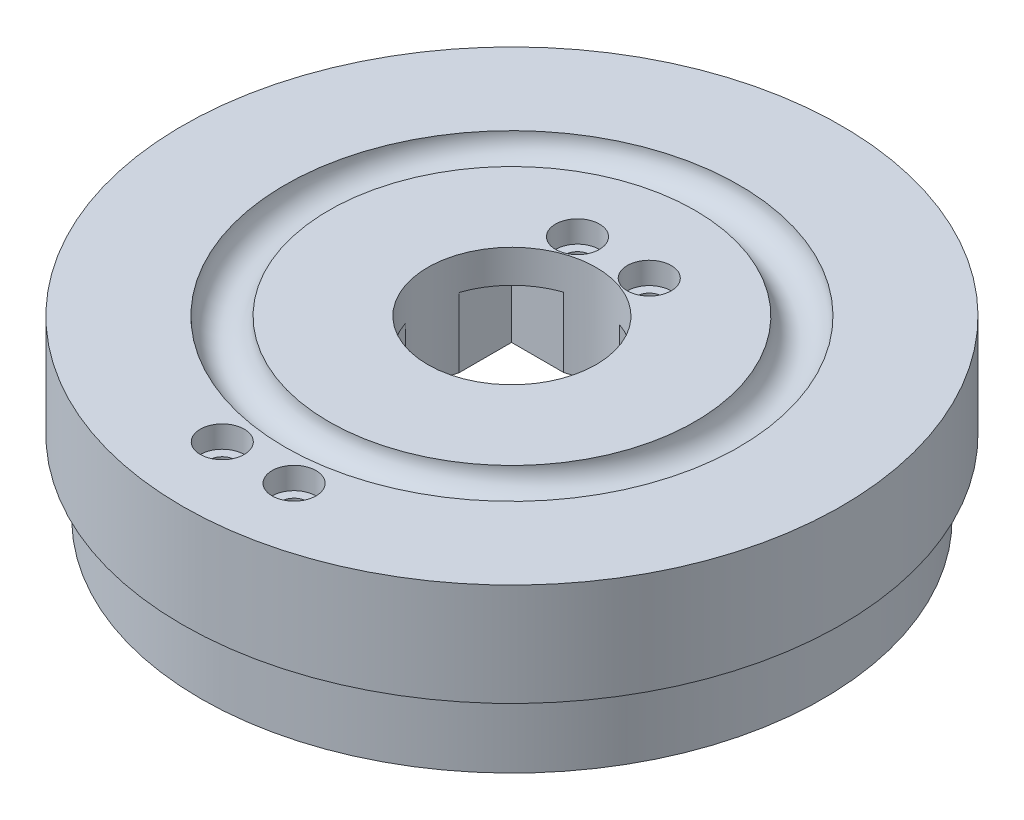
ISO-10303-21;
HEADER;
FILE_DESCRIPTION(('STEP AP214'),'2;1');
FILE_NAME('part.step','',(''),(''),'','','');
FILE_SCHEMA(('AUTOMOTIVE_DESIGN { 1 0 10303 214 1 1 1 1 }'));
ENDSEC;
DATA;
#1=APPLICATION_CONTEXT('core data for automotive mechanical design processes');
#2=APPLICATION_PROTOCOL_DEFINITION('international standard','automotive_design',2000,#1);
#3=PRODUCT_CONTEXT('',#1,'mechanical');
#4=PRODUCT('Part','Part','',(#3));
#5=PRODUCT_RELATED_PRODUCT_CATEGORY('part','',(#4));
#6=PRODUCT_DEFINITION_FORMATION('','',#4);
#7=PRODUCT_DEFINITION_CONTEXT('part definition',#1,'design');
#8=PRODUCT_DEFINITION('design','',#6,#7);
#9=PRODUCT_DEFINITION_SHAPE('','',#8);
#10=(LENGTH_UNIT() NAMED_UNIT(*) SI_UNIT(.MILLI.,.METRE.));
#11=(NAMED_UNIT(*) PLANE_ANGLE_UNIT() SI_UNIT($,.RADIAN.));
#12=(NAMED_UNIT(*) SI_UNIT($,.STERADIAN.) SOLID_ANGLE_UNIT());
#13=UNCERTAINTY_MEASURE_WITH_UNIT(LENGTH_MEASURE(1.E-05),#10,'distance_accuracy_value','');
#14=(GEOMETRIC_REPRESENTATION_CONTEXT(3) GLOBAL_UNCERTAINTY_ASSIGNED_CONTEXT((#13)) GLOBAL_UNIT_ASSIGNED_CONTEXT((#10,
#11,#12)) REPRESENTATION_CONTEXT('',''));
#15=CARTESIAN_POINT('',(0.,0.,0.));
#16=DIRECTION('',(0.,0.,1.));
#17=DIRECTION('',(1.,0.,0.));
#18=AXIS2_PLACEMENT_3D('',#15,#16,#17);
#19=CARTESIAN_POINT('',(0.,0.,0.));
#20=DIRECTION('',(0.,1.,0.));
#21=DIRECTION('',(0.,0.,1.));
#22=AXIS2_PLACEMENT_3D('',#19,#20,#21);
#23=PLANE('',#22);
#24=CARTESIAN_POINT('',(-4.89999999999999,0.,-13.85));
#25=DIRECTION('',(0.,-1.,0.));
#26=DIRECTION('',(0.,0.,-1.));
#27=AXIS2_PLACEMENT_3D('',#24,#25,#26);
#28=CIRCLE('',#27,1.75);
#29=CARTESIAN_POINT('',(-4.89999999999999,0.,-15.6));
#30=VERTEX_POINT('',#29);
#31=EDGE_CURVE('E153',#30,#30,#28,.T.);
#32=ORIENTED_EDGE('',*,*,#31,.F.);
#33=EDGE_LOOP('',(#32));
#34=FACE_BOUND('',#33,.T.);
#35=CARTESIAN_POINT('',(4.90000000000001,0.,-13.85));
#36=DIRECTION('',(0.,-1.,0.));
#37=DIRECTION('',(0.,0.,-1.));
#38=AXIS2_PLACEMENT_3D('',#35,#36,#37);
#39=CIRCLE('',#38,1.75);
#40=CARTESIAN_POINT('',(4.90000000000001,0.,-15.6));
#41=VERTEX_POINT('',#40);
#42=EDGE_CURVE('E162',#41,#41,#39,.T.);
#43=ORIENTED_EDGE('',*,*,#42,.F.);
#44=EDGE_LOOP('',(#43));
#45=FACE_BOUND('',#44,.T.);
#46=CARTESIAN_POINT('',(-4.89999999999999,0.,34.65));
#47=DIRECTION('',(0.,-1.,0.));
#48=DIRECTION('',(0.,0.,-1.));
#49=AXIS2_PLACEMENT_3D('',#46,#47,#48);
#50=CIRCLE('',#49,1.75);
#51=CARTESIAN_POINT('',(-4.89999999999999,0.,32.9));
#52=VERTEX_POINT('',#51);
#53=EDGE_CURVE('E166',#52,#52,#50,.T.);
#54=ORIENTED_EDGE('',*,*,#53,.F.);
#55=EDGE_LOOP('',(#54));
#56=FACE_BOUND('',#55,.T.);
#57=CARTESIAN_POINT('',(4.90000000000001,0.,34.65));
#58=DIRECTION('',(0.,-1.,0.));
#59=DIRECTION('',(0.,0.,-1.));
#60=AXIS2_PLACEMENT_3D('',#57,#58,#59);
#61=CIRCLE('',#60,1.75);
#62=CARTESIAN_POINT('',(4.90000000000001,0.,32.9));
#63=VERTEX_POINT('',#62);
#64=EDGE_CURVE('E170',#63,#63,#61,.T.);
#65=ORIENTED_EDGE('',*,*,#64,.F.);
#66=EDGE_LOOP('',(#65));
#67=FACE_BOUND('',#66,.T.);
#68=CARTESIAN_POINT('',(0.,0.,0.));
#69=DIRECTION('',(0.,1.,0.));
#70=DIRECTION('',(0.,0.,1.));
#71=AXIS2_PLACEMENT_3D('',#68,#69,#70);
#72=CIRCLE('',#71,11.5);
#73=CARTESIAN_POINT('',(-10.9,0.,-3.6660605559647));
#74=VERTEX_POINT('',#73);
#75=CARTESIAN_POINT('',(-10.9,0.,3.6660605559647));
#76=VERTEX_POINT('',#75);
#77=EDGE_CURVE('E207',#74,#76,#72,.T.);
#78=ORIENTED_EDGE('',*,*,#77,.T.);
#79=DIRECTION('',(0.,0.,-1.));
#80=VECTOR('',#79,1.);
#81=CARTESIAN_POINT('',(-10.9,0.,-10.85));
#82=LINE('',#81,#80);
#83=CARTESIAN_POINT('',(-10.9,0.,31.65));
#84=VERTEX_POINT('',#83);
#85=EDGE_CURVE('E141',#84,#76,#82,.T.);
#86=ORIENTED_EDGE('',*,*,#85,.F.);
#87=DIRECTION('',(-1.,0.,0.));
#88=VECTOR('',#87,1.);
#89=CARTESIAN_POINT('',(-10.9,0.,31.65));
#90=LINE('',#89,#88);
#91=CARTESIAN_POINT('',(10.9,0.,31.65));
#92=VERTEX_POINT('',#91);
#93=EDGE_CURVE('E118',#92,#84,#90,.T.);
#94=ORIENTED_EDGE('',*,*,#93,.F.);
#95=DIRECTION('',(0.,0.,1.));
#96=VECTOR('',#95,1.);
#97=CARTESIAN_POINT('',(10.9,0.,-10.85));
#98=LINE('',#97,#96);
#99=CARTESIAN_POINT('',(10.9,0.,3.66606055596465));
#100=VERTEX_POINT('',#99);
#101=EDGE_CURVE('E146',#100,#92,#98,.T.);
#102=ORIENTED_EDGE('',*,*,#101,.F.);
#103=CARTESIAN_POINT('',(10.9,0.,-3.66606055596465));
#104=VERTEX_POINT('',#103);
#105=EDGE_CURVE('E203',#100,#104,#72,.T.);
#106=ORIENTED_EDGE('',*,*,#105,.T.);
#107=CARTESIAN_POINT('',(10.9,0.,-10.85));
#108=VERTEX_POINT('',#107);
#109=EDGE_CURVE('E147',#108,#104,#98,.T.);
#110=ORIENTED_EDGE('',*,*,#109,.F.);
#111=DIRECTION('',(1.,0.,0.));
#112=VECTOR('',#111,1.);
#113=CARTESIAN_POINT('',(-10.9,0.,-10.85));
#114=LINE('',#113,#112);
#115=CARTESIAN_POINT('',(3.81149576937974,0.,-10.85));
#116=VERTEX_POINT('',#115);
#117=EDGE_CURVE('E143',#116,#108,#114,.T.);
#118=ORIENTED_EDGE('',*,*,#117,.F.);
#119=CARTESIAN_POINT('',(-3.81149576937974,0.,-10.85));
#120=VERTEX_POINT('',#119);
#121=EDGE_CURVE('E206',#116,#120,#72,.T.);
#122=ORIENTED_EDGE('',*,*,#121,.T.);
#123=CARTESIAN_POINT('',(-10.9,0.,-10.85));
#124=VERTEX_POINT('',#123);
#125=EDGE_CURVE('E144',#124,#120,#114,.T.);
#126=ORIENTED_EDGE('',*,*,#125,.F.);
#127=EDGE_CURVE('E124',#74,#124,#82,.T.);
#128=ORIENTED_EDGE('',*,*,#127,.F.);
#129=EDGE_LOOP('',(#78,#86,#94,#102,#106,#110,#118,#122,#126,#128));
#130=FACE_BOUND('',#129,.T.);
#131=CARTESIAN_POINT('',(0.,0.,0.));
#132=DIRECTION('',(0.,-1.,0.));
#133=DIRECTION('',(0.,0.,-1.));
#134=AXIS2_PLACEMENT_3D('',#131,#132,#133);
#135=CIRCLE('',#134,40.5);
#136=CARTESIAN_POINT('',(0.,0.,-40.5));
#137=VERTEX_POINT('',#136);
#138=EDGE_CURVE('E283',#137,#137,#135,.T.);
#139=ORIENTED_EDGE('',*,*,#138,.T.);
#140=EDGE_LOOP('',(#139));
#141=FACE_BOUND('',#140,.T.);
#142=ADVANCED_FACE('F35',(#34,#45,#56,#67,#130,#141),#23,.F.);
#143=CARTESIAN_POINT('',(0.,14.,0.));
#144=DIRECTION('',(0.,1.,0.));
#145=DIRECTION('',(0.,0.,1.));
#146=AXIS2_PLACEMENT_3D('',#143,#144,#145);
#147=PLANE('',#146);
#148=CARTESIAN_POINT('',(4.9,14.,34.65));
#149=DIRECTION('',(0.,1.,0.));
#150=DIRECTION('',(0.,0.,1.));
#151=AXIS2_PLACEMENT_3D('',#148,#149,#150);
#152=CIRCLE('',#151,3.);
#153=CARTESIAN_POINT('',(4.9,14.,37.65));
#154=VERTEX_POINT('',#153);
#155=EDGE_CURVE('E184',#154,#154,#152,.T.);
#156=ORIENTED_EDGE('',*,*,#155,.F.);
#157=EDGE_LOOP('',(#156));
#158=FACE_BOUND('',#157,.T.);
#159=CARTESIAN_POINT('',(-4.9,14.,34.65));
#160=DIRECTION('',(0.,1.,0.));
#161=DIRECTION('',(0.,0.,1.));
#162=AXIS2_PLACEMENT_3D('',#159,#160,#161);
#163=CIRCLE('',#162,3.);
#164=CARTESIAN_POINT('',(-4.9,14.,37.65));
#165=VERTEX_POINT('',#164);
#166=EDGE_CURVE('E190',#165,#165,#163,.T.);
#167=ORIENTED_EDGE('',*,*,#166,.F.);
#168=EDGE_LOOP('',(#167));
#169=FACE_BOUND('',#168,.T.);
#170=CARTESIAN_POINT('',(0.,14.,0.));
#171=DIRECTION('',(0.,1.,0.));
#172=DIRECTION('',(0.,0.,1.));
#173=AXIS2_PLACEMENT_3D('',#170,#171,#172);
#174=CIRCLE('',#173,45.);
#175=CARTESIAN_POINT('',(0.,14.,45.));
#176=VERTEX_POINT('',#175);
#177=EDGE_CURVE('E208',#176,#176,#174,.T.);
#178=ORIENTED_EDGE('',*,*,#177,.T.);
#179=EDGE_LOOP('',(#178));
#180=FACE_BOUND('',#179,.T.);
#181=CARTESIAN_POINT('',(0.,14.,0.));
#182=DIRECTION('',(0.,1.,0.));
#183=DIRECTION('',(0.,0.,1.));
#184=AXIS2_PLACEMENT_3D('',#181,#182,#183);
#185=CIRCLE('',#184,31.);
#186=CARTESIAN_POINT('',(0.,14.,31.));
#187=VERTEX_POINT('',#186);
#188=EDGE_CURVE('E216',#187,#187,#185,.T.);
#189=ORIENTED_EDGE('',*,*,#188,.F.);
#190=EDGE_LOOP('',(#189));
#191=FACE_BOUND('',#190,.T.);
#192=ADVANCED_FACE('F303',(#158,#169,#180,#191),#147,.T.);
#193=CARTESIAN_POINT('',(4.9,14.,-13.85));
#194=DIRECTION('',(0.,1.,0.));
#195=DIRECTION('',(0.,0.,1.));
#196=AXIS2_PLACEMENT_3D('',#193,#194,#195);
#197=CIRCLE('',#196,3.);
#198=CARTESIAN_POINT('',(4.9,14.,-10.85));
#199=VERTEX_POINT('',#198);
#200=EDGE_CURVE('E178',#199,#199,#197,.T.);
#201=ORIENTED_EDGE('',*,*,#200,.F.);
#202=EDGE_LOOP('',(#201));
#203=FACE_BOUND('',#202,.T.);
#204=CARTESIAN_POINT('',(-4.9,14.,-13.85));
#205=DIRECTION('',(0.,1.,0.));
#206=DIRECTION('',(0.,0.,1.));
#207=AXIS2_PLACEMENT_3D('',#204,#205,#206);
#208=CIRCLE('',#207,3.);
#209=CARTESIAN_POINT('',(-4.9,14.,-10.85));
#210=VERTEX_POINT('',#209);
#211=EDGE_CURVE('E177',#210,#210,#208,.T.);
#212=ORIENTED_EDGE('',*,*,#211,.F.);
#213=EDGE_LOOP('',(#212));
#214=FACE_BOUND('',#213,.T.);
#215=CARTESIAN_POINT('',(0.,14.,0.));
#216=DIRECTION('',(0.,1.,0.));
#217=DIRECTION('',(0.,0.,1.));
#218=AXIS2_PLACEMENT_3D('',#215,#216,#217);
#219=CIRCLE('',#218,11.5);
#220=CARTESIAN_POINT('',(0.,14.,11.5));
#221=VERTEX_POINT('',#220);
#222=EDGE_CURVE('E199',#221,#221,#219,.T.);
#223=ORIENTED_EDGE('',*,*,#222,.F.);
#224=EDGE_LOOP('',(#223));
#225=FACE_BOUND('',#224,.T.);
#226=CARTESIAN_POINT('',(0.,14.,0.));
#227=DIRECTION('',(0.,-1.,0.));
#228=DIRECTION('',(0.,0.,-1.));
#229=AXIS2_PLACEMENT_3D('',#226,#227,#228);
#230=CIRCLE('',#229,25.);
#231=CARTESIAN_POINT('',(0.,14.,-25.));
#232=VERTEX_POINT('',#231);
#233=EDGE_CURVE('E196',#232,#232,#230,.T.);
#234=ORIENTED_EDGE('',*,*,#233,.F.);
#235=EDGE_LOOP('',(#234));
#236=FACE_BOUND('',#235,.T.);
#237=ADVANCED_FACE('F309',(#203,#214,#225,#236),#147,.T.);
#238=CARTESIAN_POINT('',(0.,0.,0.));
#239=DIRECTION('',(0.,1.,0.));
#240=DIRECTION('',(0.,0.,1.));
#241=AXIS2_PLACEMENT_3D('',#238,#239,#240);
#242=CIRCLE('',#241,42.5);
#243=CARTESIAN_POINT('',(0.,0.,42.5));
#244=VERTEX_POINT('',#243);
#245=EDGE_CURVE('E11',#244,#244,#242,.F.);
#246=ORIENTED_EDGE('',*,*,#245,.F.);
#247=EDGE_LOOP('',(#246));
#248=FACE_BOUND('',#247,.T.);
#249=CARTESIAN_POINT('',(0.,0.,0.));
#250=DIRECTION('',(0.,1.,0.));
#251=DIRECTION('',(0.,0.,1.));
#252=AXIS2_PLACEMENT_3D('',#249,#250,#251);
#253=CIRCLE('',#252,45.);
#254=CARTESIAN_POINT('',(0.,0.,45.));
#255=VERTEX_POINT('',#254);
#256=EDGE_CURVE('E202',#255,#255,#253,.T.);
#257=ORIENTED_EDGE('',*,*,#256,.F.);
#258=EDGE_LOOP('',(#257));
#259=FACE_BOUND('',#258,.T.);
#260=ADVANCED_FACE('F305',(#248,#259),#23,.F.);
#261=CARTESIAN_POINT('',(0.,14.,0.));
#262=DIRECTION('',(0.,-1.,0.));
#263=DIRECTION('',(0.,0.,-1.));
#264=AXIS2_PLACEMENT_3D('',#261,#262,#263);
#265=CYLINDRICAL_SURFACE('',#264,45.);
#266=ORIENTED_EDGE('',*,*,#177,.F.);
#267=EDGE_LOOP('',(#266));
#268=FACE_BOUND('',#267,.T.);
#269=ORIENTED_EDGE('',*,*,#256,.T.);
#270=EDGE_LOOP('',(#269));
#271=FACE_BOUND('',#270,.T.);
#272=ADVANCED_FACE('F37',(#268,#271),#265,.T.);
#273=CARTESIAN_POINT('',(0.,14.,0.));
#274=DIRECTION('',(0.,-1.,0.));
#275=DIRECTION('',(0.,0.,-1.));
#276=AXIS2_PLACEMENT_3D('',#273,#274,#275);
#277=CYLINDRICAL_SURFACE('',#276,11.5);
#278=DIRECTION('',(0.,-1.,0.));
#279=VECTOR('',#278,1.);
#280=CARTESIAN_POINT('',(10.9,14.,-3.66606055596465));
#281=LINE('',#280,#279);
#282=CARTESIAN_POINT('',(10.9,9.5,-3.66606055596465));
#283=VERTEX_POINT('',#282);
#284=EDGE_CURVE('E43',#104,#283,#281,.F.);
#285=ORIENTED_EDGE('',*,*,#284,.F.);
#286=ORIENTED_EDGE('',*,*,#105,.F.);
#287=DIRECTION('',(0.,-1.,0.));
#288=VECTOR('',#287,1.);
#289=CARTESIAN_POINT('',(10.9,14.,3.66606055596465));
#290=LINE('',#289,#288);
#291=CARTESIAN_POINT('',(10.9,9.5,3.66606055596465));
#292=VERTEX_POINT('',#291);
#293=EDGE_CURVE('E228',#292,#100,#290,.T.);
#294=ORIENTED_EDGE('',*,*,#293,.F.);
#295=CARTESIAN_POINT('',(0.,9.5,0.));
#296=DIRECTION('',(0.,1.,0.));
#297=DIRECTION('',(0.,0.,1.));
#298=AXIS2_PLACEMENT_3D('',#295,#296,#297);
#299=CIRCLE('',#298,11.5);
#300=CARTESIAN_POINT('',(-10.9,9.5,3.6660605559647));
#301=VERTEX_POINT('',#300);
#302=EDGE_CURVE('E211',#301,#292,#299,.T.);
#303=ORIENTED_EDGE('',*,*,#302,.F.);
#304=DIRECTION('',(0.,-1.,0.));
#305=VECTOR('',#304,1.);
#306=CARTESIAN_POINT('',(-10.9,14.,3.6660605559647));
#307=LINE('',#306,#305);
#308=EDGE_CURVE('E231',#76,#301,#307,.F.);
#309=ORIENTED_EDGE('',*,*,#308,.F.);
#310=ORIENTED_EDGE('',*,*,#77,.F.);
#311=DIRECTION('',(0.,-1.,0.));
#312=VECTOR('',#311,1.);
#313=CARTESIAN_POINT('',(-10.9,14.,-3.6660605559647));
#314=LINE('',#313,#312);
#315=CARTESIAN_POINT('',(-10.9,9.5,-3.6660605559647));
#316=VERTEX_POINT('',#315);
#317=EDGE_CURVE('E235',#316,#74,#314,.T.);
#318=ORIENTED_EDGE('',*,*,#317,.F.);
#319=CARTESIAN_POINT('',(-3.81149576937974,9.5,-10.85));
#320=VERTEX_POINT('',#319);
#321=EDGE_CURVE('E114',#320,#316,#299,.T.);
#322=ORIENTED_EDGE('',*,*,#321,.F.);
#323=DIRECTION('',(0.,-1.,0.));
#324=VECTOR('',#323,1.);
#325=CARTESIAN_POINT('',(-3.81149576937974,14.,-10.85));
#326=LINE('',#325,#324);
#327=EDGE_CURVE('E132',#120,#320,#326,.F.);
#328=ORIENTED_EDGE('',*,*,#327,.F.);
#329=ORIENTED_EDGE('',*,*,#121,.F.);
#330=DIRECTION('',(0.,-1.,0.));
#331=VECTOR('',#330,1.);
#332=CARTESIAN_POINT('',(3.81149576937974,14.,-10.85));
#333=LINE('',#332,#331);
#334=CARTESIAN_POINT('',(3.81149576937974,9.5,-10.85));
#335=VERTEX_POINT('',#334);
#336=EDGE_CURVE('E237',#335,#116,#333,.T.);
#337=ORIENTED_EDGE('',*,*,#336,.F.);
#338=EDGE_CURVE('E229',#283,#335,#299,.T.);
#339=ORIENTED_EDGE('',*,*,#338,.F.);
#340=EDGE_LOOP('',(#285,#286,#294,#303,#309,#310,#318,#322,#328,#329,#337,#339));
#341=FACE_BOUND('',#340,.T.);
#342=ORIENTED_EDGE('',*,*,#222,.T.);
#343=EDGE_LOOP('',(#342));
#344=FACE_BOUND('',#343,.T.);
#345=ADVANCED_FACE('F246',(#341,#344),#277,.F.);
#346=CARTESIAN_POINT('',(0.,14.,0.));
#347=DIRECTION('',(0.,1.,0.));
#348=DIRECTION('',(0.,0.,1.));
#349=AXIS2_PLACEMENT_3D('',#346,#347,#348);
#350=TOROIDAL_SURFACE('',#349,28.,3.);
#351=ORIENTED_EDGE('',*,*,#188,.T.);
#352=EDGE_LOOP('',(#351));
#353=FACE_BOUND('',#352,.T.);
#354=ORIENTED_EDGE('',*,*,#233,.T.);
#355=EDGE_LOOP('',(#354));
#356=FACE_BOUND('',#355,.T.);
#357=ADVANCED_FACE('F334',(#353,#356),#350,.F.);
#358=CARTESIAN_POINT('',(-4.9,11.,34.65));
#359=DIRECTION('',(0.,1.,0.));
#360=DIRECTION('',(0.,0.,1.));
#361=AXIS2_PLACEMENT_3D('',#358,#359,#360);
#362=CYLINDRICAL_SURFACE('',#361,3.);
#363=CARTESIAN_POINT('',(-4.9,11.,34.65));
#364=DIRECTION('',(0.,1.,0.));
#365=DIRECTION('',(0.,0.,1.));
#366=AXIS2_PLACEMENT_3D('',#363,#364,#365);
#367=CIRCLE('',#366,3.);
#368=CARTESIAN_POINT('',(-4.9,11.,37.65));
#369=VERTEX_POINT('',#368);
#370=EDGE_CURVE('E193',#369,#369,#367,.T.);
#371=ORIENTED_EDGE('',*,*,#370,.F.);
#372=EDGE_LOOP('',(#371));
#373=FACE_BOUND('',#372,.T.);
#374=ORIENTED_EDGE('',*,*,#166,.T.);
#375=EDGE_LOOP('',(#374));
#376=FACE_BOUND('',#375,.T.);
#377=ADVANCED_FACE('F337',(#373,#376),#362,.F.);
#378=CARTESIAN_POINT('',(-4.9,11.,34.65));
#379=DIRECTION('',(0.,1.,0.));
#380=DIRECTION('',(0.,0.,1.));
#381=AXIS2_PLACEMENT_3D('',#378,#379,#380);
#382=PLANE('',#381);
#383=CARTESIAN_POINT('',(-4.89999999999999,11.,34.65));
#384=DIRECTION('',(0.,1.,0.));
#385=DIRECTION('',(0.,0.,1.));
#386=AXIS2_PLACEMENT_3D('',#383,#384,#385);
#387=CIRCLE('',#386,1.75);
#388=CARTESIAN_POINT('',(-4.89999999999999,11.,36.4));
#389=VERTEX_POINT('',#388);
#390=EDGE_CURVE('E169',#389,#389,#387,.T.);
#391=ORIENTED_EDGE('',*,*,#390,.F.);
#392=EDGE_LOOP('',(#391));
#393=FACE_BOUND('',#392,.T.);
#394=ORIENTED_EDGE('',*,*,#370,.T.);
#395=EDGE_LOOP('',(#394));
#396=FACE_BOUND('',#395,.T.);
#397=ADVANCED_FACE('F341',(#393,#396),#382,.T.);
#398=CARTESIAN_POINT('',(4.9,11.,34.65));
#399=DIRECTION('',(0.,1.,0.));
#400=DIRECTION('',(0.,0.,1.));
#401=AXIS2_PLACEMENT_3D('',#398,#399,#400);
#402=CYLINDRICAL_SURFACE('',#401,3.);
#403=CARTESIAN_POINT('',(4.9,11.,34.65));
#404=DIRECTION('',(0.,1.,0.));
#405=DIRECTION('',(0.,0.,1.));
#406=AXIS2_PLACEMENT_3D('',#403,#404,#405);
#407=CIRCLE('',#406,3.);
#408=CARTESIAN_POINT('',(4.9,11.,37.65));
#409=VERTEX_POINT('',#408);
#410=EDGE_CURVE('E187',#409,#409,#407,.T.);
#411=ORIENTED_EDGE('',*,*,#410,.F.);
#412=EDGE_LOOP('',(#411));
#413=FACE_BOUND('',#412,.T.);
#414=ORIENTED_EDGE('',*,*,#155,.T.);
#415=EDGE_LOOP('',(#414));
#416=FACE_BOUND('',#415,.T.);
#417=ADVANCED_FACE('F345',(#413,#416),#402,.F.);
#418=CARTESIAN_POINT('',(4.9,11.,34.65));
#419=DIRECTION('',(0.,1.,0.));
#420=DIRECTION('',(0.,0.,1.));
#421=AXIS2_PLACEMENT_3D('',#418,#419,#420);
#422=PLANE('',#421);
#423=CARTESIAN_POINT('',(4.90000000000001,11.,34.65));
#424=DIRECTION('',(0.,1.,0.));
#425=DIRECTION('',(0.,0.,1.));
#426=AXIS2_PLACEMENT_3D('',#423,#424,#425);
#427=CIRCLE('',#426,1.75);
#428=CARTESIAN_POINT('',(4.90000000000001,11.,36.4));
#429=VERTEX_POINT('',#428);
#430=EDGE_CURVE('E173',#429,#429,#427,.T.);
#431=ORIENTED_EDGE('',*,*,#430,.F.);
#432=EDGE_LOOP('',(#431));
#433=FACE_BOUND('',#432,.T.);
#434=ORIENTED_EDGE('',*,*,#410,.T.);
#435=EDGE_LOOP('',(#434));
#436=FACE_BOUND('',#435,.T.);
#437=ADVANCED_FACE('F349',(#433,#436),#422,.T.);
#438=CARTESIAN_POINT('',(-4.9,11.,-13.85));
#439=DIRECTION('',(0.,1.,0.));
#440=DIRECTION('',(0.,0.,1.));
#441=AXIS2_PLACEMENT_3D('',#438,#439,#440);
#442=CYLINDRICAL_SURFACE('',#441,3.);
#443=CARTESIAN_POINT('',(-4.9,11.,-13.85));
#444=DIRECTION('',(0.,1.,0.));
#445=DIRECTION('',(0.,0.,1.));
#446=AXIS2_PLACEMENT_3D('',#443,#444,#445);
#447=CIRCLE('',#446,3.);
#448=CARTESIAN_POINT('',(-4.9,11.,-10.85));
#449=VERTEX_POINT('',#448);
#450=EDGE_CURVE('E181',#449,#449,#447,.T.);
#451=ORIENTED_EDGE('',*,*,#450,.F.);
#452=EDGE_LOOP('',(#451));
#453=FACE_BOUND('',#452,.T.);
#454=ORIENTED_EDGE('',*,*,#211,.T.);
#455=EDGE_LOOP('',(#454));
#456=FACE_BOUND('',#455,.T.);
#457=ADVANCED_FACE('F353',(#453,#456),#442,.F.);
#458=CARTESIAN_POINT('',(-4.9,11.,-13.85));
#459=DIRECTION('',(0.,1.,0.));
#460=DIRECTION('',(0.,0.,1.));
#461=AXIS2_PLACEMENT_3D('',#458,#459,#460);
#462=PLANE('',#461);
#463=CARTESIAN_POINT('',(-4.89999999999999,11.,-13.85));
#464=DIRECTION('',(0.,1.,0.));
#465=DIRECTION('',(0.,0.,1.));
#466=AXIS2_PLACEMENT_3D('',#463,#464,#465);
#467=CIRCLE('',#466,1.75);
#468=CARTESIAN_POINT('',(-4.89999999999999,11.,-12.1));
#469=VERTEX_POINT('',#468);
#470=EDGE_CURVE('E161',#469,#469,#467,.T.);
#471=ORIENTED_EDGE('',*,*,#470,.F.);
#472=EDGE_LOOP('',(#471));
#473=FACE_BOUND('',#472,.T.);
#474=ORIENTED_EDGE('',*,*,#450,.T.);
#475=EDGE_LOOP('',(#474));
#476=FACE_BOUND('',#475,.T.);
#477=ADVANCED_FACE('F357',(#473,#476),#462,.T.);
#478=CARTESIAN_POINT('',(4.9,11.,-13.85));
#479=DIRECTION('',(0.,1.,0.));
#480=DIRECTION('',(0.,0.,1.));
#481=AXIS2_PLACEMENT_3D('',#478,#479,#480);
#482=CYLINDRICAL_SURFACE('',#481,3.);
#483=CARTESIAN_POINT('',(4.9,11.,-13.85));
#484=DIRECTION('',(0.,1.,0.));
#485=DIRECTION('',(0.,0.,1.));
#486=AXIS2_PLACEMENT_3D('',#483,#484,#485);
#487=CIRCLE('',#486,3.);
#488=CARTESIAN_POINT('',(4.9,11.,-10.85));
#489=VERTEX_POINT('',#488);
#490=EDGE_CURVE('E174',#489,#489,#487,.T.);
#491=ORIENTED_EDGE('',*,*,#490,.F.);
#492=EDGE_LOOP('',(#491));
#493=FACE_BOUND('',#492,.T.);
#494=ORIENTED_EDGE('',*,*,#200,.T.);
#495=EDGE_LOOP('',(#494));
#496=FACE_BOUND('',#495,.T.);
#497=ADVANCED_FACE('F361',(#493,#496),#482,.F.);
#498=CARTESIAN_POINT('',(4.9,11.,-13.85));
#499=DIRECTION('',(0.,1.,0.));
#500=DIRECTION('',(0.,0.,1.));
#501=AXIS2_PLACEMENT_3D('',#498,#499,#500);
#502=PLANE('',#501);
#503=CARTESIAN_POINT('',(4.90000000000001,11.,-13.85));
#504=DIRECTION('',(0.,1.,0.));
#505=DIRECTION('',(0.,0.,1.));
#506=AXIS2_PLACEMENT_3D('',#503,#504,#505);
#507=CIRCLE('',#506,1.75);
#508=CARTESIAN_POINT('',(4.90000000000001,11.,-12.1));
#509=VERTEX_POINT('',#508);
#510=EDGE_CURVE('E165',#509,#509,#507,.T.);
#511=ORIENTED_EDGE('',*,*,#510,.F.);
#512=EDGE_LOOP('',(#511));
#513=FACE_BOUND('',#512,.T.);
#514=ORIENTED_EDGE('',*,*,#490,.T.);
#515=EDGE_LOOP('',(#514));
#516=FACE_BOUND('',#515,.T.);
#517=ADVANCED_FACE('F365',(#513,#516),#502,.T.);
#518=CARTESIAN_POINT('',(4.90000000000001,13.,34.65));
#519=DIRECTION('',(0.,-1.,0.));
#520=DIRECTION('',(0.,0.,-1.));
#521=AXIS2_PLACEMENT_3D('',#518,#519,#520);
#522=CYLINDRICAL_SURFACE('',#521,1.75);
#523=ORIENTED_EDGE('',*,*,#430,.T.);
#524=EDGE_LOOP('',(#523));
#525=FACE_BOUND('',#524,.T.);
#526=ORIENTED_EDGE('',*,*,#64,.T.);
#527=EDGE_LOOP('',(#526));
#528=FACE_BOUND('',#527,.T.);
#529=ADVANCED_FACE('F369',(#525,#528),#522,.F.);
#530=CARTESIAN_POINT('',(-4.89999999999999,13.,34.65));
#531=DIRECTION('',(0.,-1.,0.));
#532=DIRECTION('',(0.,0.,-1.));
#533=AXIS2_PLACEMENT_3D('',#530,#531,#532);
#534=CYLINDRICAL_SURFACE('',#533,1.75);
#535=ORIENTED_EDGE('',*,*,#390,.T.);
#536=EDGE_LOOP('',(#535));
#537=FACE_BOUND('',#536,.T.);
#538=ORIENTED_EDGE('',*,*,#53,.T.);
#539=EDGE_LOOP('',(#538));
#540=FACE_BOUND('',#539,.T.);
#541=ADVANCED_FACE('F373',(#537,#540),#534,.F.);
#542=CARTESIAN_POINT('',(4.90000000000001,13.,-13.85));
#543=DIRECTION('',(0.,-1.,0.));
#544=DIRECTION('',(0.,0.,-1.));
#545=AXIS2_PLACEMENT_3D('',#542,#543,#544);
#546=CYLINDRICAL_SURFACE('',#545,1.75);
#547=ORIENTED_EDGE('',*,*,#510,.T.);
#548=EDGE_LOOP('',(#547));
#549=FACE_BOUND('',#548,.T.);
#550=ORIENTED_EDGE('',*,*,#42,.T.);
#551=EDGE_LOOP('',(#550));
#552=FACE_BOUND('',#551,.T.);
#553=ADVANCED_FACE('F377',(#549,#552),#546,.F.);
#554=CARTESIAN_POINT('',(-4.89999999999999,13.,-13.85));
#555=DIRECTION('',(0.,-1.,0.));
#556=DIRECTION('',(0.,0.,-1.));
#557=AXIS2_PLACEMENT_3D('',#554,#555,#556);
#558=CYLINDRICAL_SURFACE('',#557,1.75);
#559=ORIENTED_EDGE('',*,*,#470,.T.);
#560=EDGE_LOOP('',(#559));
#561=FACE_BOUND('',#560,.T.);
#562=ORIENTED_EDGE('',*,*,#31,.T.);
#563=EDGE_LOOP('',(#562));
#564=FACE_BOUND('',#563,.T.);
#565=ADVANCED_FACE('F381',(#561,#564),#558,.F.);
#566=CARTESIAN_POINT('',(0.,9.5,0.));
#567=DIRECTION('',(0.,1.,0.));
#568=DIRECTION('',(0.,0.,1.));
#569=AXIS2_PLACEMENT_3D('',#566,#567,#568);
#570=PLANE('',#569);
#571=ORIENTED_EDGE('',*,*,#302,.T.);
#572=DIRECTION('',(0.,0.,1.));
#573=VECTOR('',#572,1.);
#574=CARTESIAN_POINT('',(10.9,9.5,-10.85));
#575=LINE('',#574,#573);
#576=CARTESIAN_POINT('',(10.9,9.5,31.65));
#577=VERTEX_POINT('',#576);
#578=EDGE_CURVE('E133',#292,#577,#575,.T.);
#579=ORIENTED_EDGE('',*,*,#578,.T.);
#580=DIRECTION('',(-1.,0.,0.));
#581=VECTOR('',#580,1.);
#582=CARTESIAN_POINT('',(-10.9,9.5,31.65));
#583=LINE('',#582,#581);
#584=CARTESIAN_POINT('',(-10.9,9.5,31.65));
#585=VERTEX_POINT('',#584);
#586=EDGE_CURVE('E128',#577,#585,#583,.T.);
#587=ORIENTED_EDGE('',*,*,#586,.T.);
#588=DIRECTION('',(0.,0.,-1.));
#589=VECTOR('',#588,1.);
#590=CARTESIAN_POINT('',(-10.9,9.5,-10.85));
#591=LINE('',#590,#589);
#592=EDGE_CURVE('E117',#585,#301,#591,.T.);
#593=ORIENTED_EDGE('',*,*,#592,.T.);
#594=EDGE_LOOP('',(#571,#579,#587,#593));
#595=FACE_BOUND('',#594,.T.);
#596=ADVANCED_FACE('F270',(#595),#570,.F.);
#597=CARTESIAN_POINT('',(10.9,9.5,-10.85));
#598=DIRECTION('',(1.,0.,0.));
#599=DIRECTION('',(0.,0.,-1.));
#600=AXIS2_PLACEMENT_3D('',#597,#598,#599);
#601=PLANE('',#600);
#602=ORIENTED_EDGE('',*,*,#293,.T.);
#603=ORIENTED_EDGE('',*,*,#101,.T.);
#604=DIRECTION('',(0.,-1.,0.));
#605=VECTOR('',#604,1.);
#606=CARTESIAN_POINT('',(10.9,9.5,31.65));
#607=LINE('',#606,#605);
#608=EDGE_CURVE('E154',#577,#92,#607,.T.);
#609=ORIENTED_EDGE('',*,*,#608,.F.);
#610=ORIENTED_EDGE('',*,*,#578,.F.);
#611=EDGE_LOOP('',(#602,#603,#609,#610));
#612=FACE_BOUND('',#611,.T.);
#613=ADVANCED_FACE('F266',(#612),#601,.F.);
#614=CARTESIAN_POINT('',(-10.9,9.5,-10.85));
#615=DIRECTION('',(-1.,0.,0.));
#616=DIRECTION('',(0.,0.,1.));
#617=AXIS2_PLACEMENT_3D('',#614,#615,#616);
#618=PLANE('',#617);
#619=ORIENTED_EDGE('',*,*,#308,.T.);
#620=ORIENTED_EDGE('',*,*,#592,.F.);
#621=DIRECTION('',(0.,-1.,0.));
#622=VECTOR('',#621,1.);
#623=CARTESIAN_POINT('',(-10.9,9.5,31.65));
#624=LINE('',#623,#622);
#625=EDGE_CURVE('E151',#585,#84,#624,.T.);
#626=ORIENTED_EDGE('',*,*,#625,.T.);
#627=ORIENTED_EDGE('',*,*,#85,.T.);
#628=EDGE_LOOP('',(#619,#620,#626,#627));
#629=FACE_BOUND('',#628,.T.);
#630=ADVANCED_FACE('F273',(#629),#618,.F.);
#631=CARTESIAN_POINT('',(-10.9,9.5,31.65));
#632=DIRECTION('',(0.,0.,1.));
#633=DIRECTION('',(1.,0.,0.));
#634=AXIS2_PLACEMENT_3D('',#631,#632,#633);
#635=PLANE('',#634);
#636=ORIENTED_EDGE('',*,*,#93,.T.);
#637=ORIENTED_EDGE('',*,*,#625,.F.);
#638=ORIENTED_EDGE('',*,*,#586,.F.);
#639=ORIENTED_EDGE('',*,*,#608,.T.);
#640=EDGE_LOOP('',(#636,#637,#638,#639));
#641=FACE_BOUND('',#640,.T.);
#642=ADVANCED_FACE('F388',(#641),#635,.F.);
#643=ORIENTED_EDGE('',*,*,#321,.T.);
#644=CARTESIAN_POINT('',(-10.9,9.5,-10.85));
#645=VERTEX_POINT('',#644);
#646=EDGE_CURVE('E110',#316,#645,#591,.T.);
#647=ORIENTED_EDGE('',*,*,#646,.T.);
#648=DIRECTION('',(1.,0.,0.));
#649=VECTOR('',#648,1.);
#650=CARTESIAN_POINT('',(-10.9,9.5,-10.85));
#651=LINE('',#650,#649);
#652=EDGE_CURVE('E58',#645,#320,#651,.T.);
#653=ORIENTED_EDGE('',*,*,#652,.T.);
#654=EDGE_LOOP('',(#643,#647,#653));
#655=FACE_BOUND('',#654,.T.);
#656=ADVANCED_FACE('F112',(#655),#570,.F.);
#657=CARTESIAN_POINT('',(-10.9,9.5,-10.85));
#658=DIRECTION('',(0.,0.,-1.));
#659=DIRECTION('',(-1.,0.,0.));
#660=AXIS2_PLACEMENT_3D('',#657,#658,#659);
#661=PLANE('',#660);
#662=ORIENTED_EDGE('',*,*,#327,.T.);
#663=ORIENTED_EDGE('',*,*,#652,.F.);
#664=DIRECTION('',(0.,-1.,0.));
#665=VECTOR('',#664,1.);
#666=CARTESIAN_POINT('',(-10.9,9.5,-10.85));
#667=LINE('',#666,#665);
#668=EDGE_CURVE('E121',#645,#124,#667,.T.);
#669=ORIENTED_EDGE('',*,*,#668,.T.);
#670=ORIENTED_EDGE('',*,*,#125,.T.);
#671=EDGE_LOOP('',(#662,#663,#669,#670));
#672=FACE_BOUND('',#671,.T.);
#673=ADVANCED_FACE('F130',(#672),#661,.F.);
#674=ORIENTED_EDGE('',*,*,#317,.T.);
#675=ORIENTED_EDGE('',*,*,#127,.T.);
#676=ORIENTED_EDGE('',*,*,#668,.F.);
#677=ORIENTED_EDGE('',*,*,#646,.F.);
#678=EDGE_LOOP('',(#674,#675,#676,#677));
#679=FACE_BOUND('',#678,.T.);
#680=ADVANCED_FACE('F122',(#679),#618,.F.);
#681=ORIENTED_EDGE('',*,*,#336,.T.);
#682=ORIENTED_EDGE('',*,*,#117,.T.);
#683=DIRECTION('',(0.,-1.,0.));
#684=VECTOR('',#683,1.);
#685=CARTESIAN_POINT('',(10.9,9.5,-10.85));
#686=LINE('',#685,#684);
#687=CARTESIAN_POINT('',(10.9,9.5,-10.85));
#688=VERTEX_POINT('',#687);
#689=EDGE_CURVE('E127',#688,#108,#686,.T.);
#690=ORIENTED_EDGE('',*,*,#689,.F.);
#691=EDGE_CURVE('E134',#335,#688,#651,.T.);
#692=ORIENTED_EDGE('',*,*,#691,.F.);
#693=EDGE_LOOP('',(#681,#682,#690,#692));
#694=FACE_BOUND('',#693,.T.);
#695=ADVANCED_FACE('F253',(#694),#661,.F.);
#696=ORIENTED_EDGE('',*,*,#338,.T.);
#697=ORIENTED_EDGE('',*,*,#691,.T.);
#698=EDGE_CURVE('E50',#688,#283,#575,.T.);
#699=ORIENTED_EDGE('',*,*,#698,.T.);
#700=EDGE_LOOP('',(#696,#697,#699));
#701=FACE_BOUND('',#700,.T.);
#702=ADVANCED_FACE('F250',(#701),#570,.F.);
#703=ORIENTED_EDGE('',*,*,#284,.T.);
#704=ORIENTED_EDGE('',*,*,#698,.F.);
#705=ORIENTED_EDGE('',*,*,#689,.T.);
#706=ORIENTED_EDGE('',*,*,#109,.T.);
#707=EDGE_LOOP('',(#703,#704,#705,#706));
#708=FACE_BOUND('',#707,.T.);
#709=ADVANCED_FACE('F241',(#708),#601,.F.);
#710=CARTESIAN_POINT('',(0.,-10.,0.));
#711=DIRECTION('',(0.,1.,0.));
#712=DIRECTION('',(0.,0.,1.));
#713=AXIS2_PLACEMENT_3D('',#710,#711,#712);
#714=CYLINDRICAL_SURFACE('',#713,40.5);
#715=CARTESIAN_POINT('',(0.,-10.,0.));
#716=DIRECTION('',(0.,-1.,0.));
#717=DIRECTION('',(0.,0.,-1.));
#718=AXIS2_PLACEMENT_3D('',#715,#716,#717);
#719=CIRCLE('',#718,40.5);
#720=CARTESIAN_POINT('',(0.,-10.,-40.5));
#721=VERTEX_POINT('',#720);
#722=EDGE_CURVE('E278',#721,#721,#719,.T.);
#723=ORIENTED_EDGE('',*,*,#722,.T.);
#724=EDGE_LOOP('',(#723));
#725=FACE_BOUND('',#724,.T.);
#726=ORIENTED_EDGE('',*,*,#138,.F.);
#727=EDGE_LOOP('',(#726));
#728=FACE_BOUND('',#727,.T.);
#729=ADVANCED_FACE('F288',(#725,#728),#714,.F.);
#730=CARTESIAN_POINT('',(0.,-10.,0.));
#731=DIRECTION('',(0.,1.,0.));
#732=DIRECTION('',(0.,0.,1.));
#733=AXIS2_PLACEMENT_3D('',#730,#731,#732);
#734=CYLINDRICAL_SURFACE('',#733,42.5);
#735=CARTESIAN_POINT('',(0.,-10.,0.));
#736=DIRECTION('',(0.,-1.,0.));
#737=DIRECTION('',(0.,0.,-1.));
#738=AXIS2_PLACEMENT_3D('',#735,#736,#737);
#739=CIRCLE('',#738,42.5);
#740=CARTESIAN_POINT('',(0.,-10.,-42.5));
#741=VERTEX_POINT('',#740);
#742=EDGE_CURVE('E276',#741,#741,#739,.T.);
#743=ORIENTED_EDGE('',*,*,#742,.F.);
#744=EDGE_LOOP('',(#743));
#745=FACE_BOUND('',#744,.T.);
#746=ORIENTED_EDGE('',*,*,#245,.T.);
#747=EDGE_LOOP('',(#746));
#748=FACE_BOUND('',#747,.T.);
#749=ADVANCED_FACE('F290',(#745,#748),#734,.T.);
#750=CARTESIAN_POINT('',(0.,-10.,0.));
#751=DIRECTION('',(0.,-1.,0.));
#752=DIRECTION('',(0.,0.,-1.));
#753=AXIS2_PLACEMENT_3D('',#750,#751,#752);
#754=PLANE('',#753);
#755=ORIENTED_EDGE('',*,*,#722,.F.);
#756=EDGE_LOOP('',(#755));
#757=FACE_BOUND('',#756,.T.);
#758=ORIENTED_EDGE('',*,*,#742,.T.);
#759=EDGE_LOOP('',(#758));
#760=FACE_BOUND('',#759,.T.);
#761=ADVANCED_FACE('F297',(#757,#760),#754,.T.);
#762=CLOSED_SHELL('',(#142,#192,#237,#260,#272,#345,#357,#377,#397,#417,#437,#457,#477,#497,
#517,#529,#541,#553,#565,#596,#613,#630,#642,#656,#673,#680,#695,#702,#709,#729,#749,#761));
#763=MANIFOLD_SOLID_BREP('B2',#762);
#764=ADVANCED_BREP_SHAPE_REPRESENTATION('',(#18,#763),#14);
#765=SHAPE_DEFINITION_REPRESENTATION(#9,#764);
ENDSEC;
END-ISO-10303-21;
